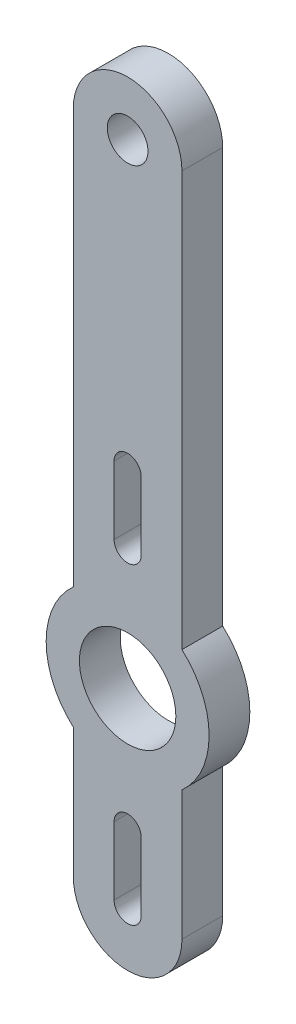
ISO-10303-21;
HEADER;
FILE_DESCRIPTION(('STEP AP214'),'2;1');
FILE_NAME('part.step','',(''),(''),'','','');
FILE_SCHEMA(('AUTOMOTIVE_DESIGN { 1 0 10303 214 1 1 1 1 }'));
ENDSEC;
DATA;
#1=APPLICATION_CONTEXT('core data for automotive mechanical design processes');
#2=APPLICATION_PROTOCOL_DEFINITION('international standard','automotive_design',2000,#1);
#3=PRODUCT_CONTEXT('',#1,'mechanical');
#4=PRODUCT('Part','Part','',(#3));
#5=PRODUCT_RELATED_PRODUCT_CATEGORY('part','',(#4));
#6=PRODUCT_DEFINITION_FORMATION('','',#4);
#7=PRODUCT_DEFINITION_CONTEXT('part definition',#1,'design');
#8=PRODUCT_DEFINITION('design','',#6,#7);
#9=PRODUCT_DEFINITION_SHAPE('','',#8);
#10=(LENGTH_UNIT() NAMED_UNIT(*) SI_UNIT(.MILLI.,.METRE.));
#11=(NAMED_UNIT(*) PLANE_ANGLE_UNIT() SI_UNIT($,.RADIAN.));
#12=(NAMED_UNIT(*) SI_UNIT($,.STERADIAN.) SOLID_ANGLE_UNIT());
#13=UNCERTAINTY_MEASURE_WITH_UNIT(LENGTH_MEASURE(1.E-05),#10,'distance_accuracy_value','');
#14=(GEOMETRIC_REPRESENTATION_CONTEXT(3) GLOBAL_UNCERTAINTY_ASSIGNED_CONTEXT((#13)) GLOBAL_UNIT_ASSIGNED_CONTEXT((#10,
#11,#12)) REPRESENTATION_CONTEXT('',''));
#15=CARTESIAN_POINT('',(0.,0.,0.));
#16=DIRECTION('',(0.,0.,1.));
#17=DIRECTION('',(1.,0.,0.));
#18=AXIS2_PLACEMENT_3D('',#15,#16,#17);
#19=CARTESIAN_POINT('',(0.,0.,3.));
#20=DIRECTION('',(0.,0.,1.));
#21=DIRECTION('',(1.,0.,0.));
#22=AXIS2_PLACEMENT_3D('',#19,#20,#21);
#23=PLANE('',#22);
#24=CARTESIAN_POINT('',(0.,14.,3.));
#25=DIRECTION('',(0.,0.,1.));
#26=DIRECTION('',(1.,0.,0.));
#27=AXIS2_PLACEMENT_3D('',#24,#25,#26);
#28=CIRCLE('',#27,3.55);
#29=CARTESIAN_POINT('',(3.55,14.,3.));
#30=VERTEX_POINT('',#29);
#31=EDGE_CURVE('E189',#30,#30,#28,.T.);
#32=ORIENTED_EDGE('',*,*,#31,.F.);
#33=EDGE_LOOP('',(#32));
#34=FACE_BOUND('',#33,.T.);
#35=CARTESIAN_POINT('',(0.,0.,3.));
#36=DIRECTION('',(0.,0.,1.));
#37=DIRECTION('',(1.,0.,0.));
#38=AXIS2_PLACEMENT_3D('',#35,#36,#37);
#39=CIRCLE('',#38,4.);
#40=CARTESIAN_POINT('',(-4.,0.,3.));
#41=VERTEX_POINT('',#40);
#42=CARTESIAN_POINT('',(4.,0.,3.));
#43=VERTEX_POINT('',#42);
#44=EDGE_CURVE('E226',#41,#43,#39,.T.);
#45=ORIENTED_EDGE('',*,*,#44,.T.);
#46=DIRECTION('',(0.,1.,0.));
#47=VECTOR('',#46,1.);
#48=CARTESIAN_POINT('',(4.,0.,3.));
#49=LINE('',#48,#47);
#50=CARTESIAN_POINT('',(4.,9.52786404500043,3.));
#51=VERTEX_POINT('',#50);
#52=EDGE_CURVE('E229',#43,#51,#49,.T.);
#53=ORIENTED_EDGE('',*,*,#52,.T.);
#54=CARTESIAN_POINT('',(0.,14.,3.));
#55=DIRECTION('',(0.,0.,1.));
#56=DIRECTION('',(1.,0.,0.));
#57=AXIS2_PLACEMENT_3D('',#54,#55,#56);
#58=CIRCLE('',#57,6.);
#59=CARTESIAN_POINT('',(4.,18.4721359549996,3.));
#60=VERTEX_POINT('',#59);
#61=EDGE_CURVE('E232',#51,#60,#58,.T.);
#62=ORIENTED_EDGE('',*,*,#61,.T.);
#63=DIRECTION('',(0.,1.,0.));
#64=VECTOR('',#63,1.);
#65=CARTESIAN_POINT('',(4.,18.4721359549996,3.));
#66=LINE('',#65,#64);
#67=CARTESIAN_POINT('',(4.,49.,3.));
#68=VERTEX_POINT('',#67);
#69=EDGE_CURVE('E234',#60,#68,#66,.T.);
#70=ORIENTED_EDGE('',*,*,#69,.T.);
#71=CARTESIAN_POINT('',(0.,49.,3.));
#72=DIRECTION('',(0.,0.,1.));
#73=DIRECTION('',(1.,0.,0.));
#74=AXIS2_PLACEMENT_3D('',#71,#72,#73);
#75=CIRCLE('',#74,4.);
#76=CARTESIAN_POINT('',(-4.,49.,3.));
#77=VERTEX_POINT('',#76);
#78=EDGE_CURVE('E236',#68,#77,#75,.T.);
#79=ORIENTED_EDGE('',*,*,#78,.T.);
#80=DIRECTION('',(0.,-1.,0.));
#81=VECTOR('',#80,1.);
#82=CARTESIAN_POINT('',(-4.,18.4721359549996,3.));
#83=LINE('',#82,#81);
#84=CARTESIAN_POINT('',(-4.,18.4721359549996,3.));
#85=VERTEX_POINT('',#84);
#86=EDGE_CURVE('E238',#77,#85,#83,.T.);
#87=ORIENTED_EDGE('',*,*,#86,.T.);
#88=CARTESIAN_POINT('',(0.,14.,3.));
#89=DIRECTION('',(0.,0.,1.));
#90=DIRECTION('',(1.,0.,0.));
#91=AXIS2_PLACEMENT_3D('',#88,#89,#90);
#92=CIRCLE('',#91,6.);
#93=CARTESIAN_POINT('',(-4.,9.52786404500043,3.));
#94=VERTEX_POINT('',#93);
#95=EDGE_CURVE('E240',#85,#94,#92,.T.);
#96=ORIENTED_EDGE('',*,*,#95,.T.);
#97=DIRECTION('',(0.,-1.,0.));
#98=VECTOR('',#97,1.);
#99=CARTESIAN_POINT('',(-4.,0.,3.));
#100=LINE('',#99,#98);
#101=EDGE_CURVE('E242',#94,#41,#100,.T.);
#102=ORIENTED_EDGE('',*,*,#101,.T.);
#103=EDGE_LOOP('',(#45,#53,#62,#70,#79,#87,#96,#102));
#104=FACE_BOUND('',#103,.T.);
#105=DIRECTION('',(0.,1.,0.));
#106=VECTOR('',#105,1.);
#107=CARTESIAN_POINT('',(1.,0.,3.));
#108=LINE('',#107,#106);
#109=CARTESIAN_POINT('',(1.,0.,3.));
#110=VERTEX_POINT('',#109);
#111=CARTESIAN_POINT('',(1.,5.,3.));
#112=VERTEX_POINT('',#111);
#113=EDGE_CURVE('E197',#110,#112,#108,.T.);
#114=ORIENTED_EDGE('',*,*,#113,.F.);
#115=CARTESIAN_POINT('',(0.,0.,3.));
#116=DIRECTION('',(0.,0.,1.));
#117=DIRECTION('',(1.,0.,0.));
#118=AXIS2_PLACEMENT_3D('',#115,#116,#117);
#119=CIRCLE('',#118,1.);
#120=CARTESIAN_POINT('',(-1.,0.,3.));
#121=VERTEX_POINT('',#120);
#122=EDGE_CURVE('E195',#121,#110,#119,.T.);
#123=ORIENTED_EDGE('',*,*,#122,.F.);
#124=DIRECTION('',(0.,-1.,0.));
#125=VECTOR('',#124,1.);
#126=CARTESIAN_POINT('',(-1.,0.,3.));
#127=LINE('',#126,#125);
#128=CARTESIAN_POINT('',(-1.,5.,3.));
#129=VERTEX_POINT('',#128);
#130=EDGE_CURVE('E203',#129,#121,#127,.T.);
#131=ORIENTED_EDGE('',*,*,#130,.F.);
#132=CARTESIAN_POINT('',(0.,5.,3.));
#133=DIRECTION('',(0.,0.,1.));
#134=DIRECTION('',(1.,0.,0.));
#135=AXIS2_PLACEMENT_3D('',#132,#133,#134);
#136=CIRCLE('',#135,1.);
#137=EDGE_CURVE('E200',#112,#129,#136,.T.);
#138=ORIENTED_EDGE('',*,*,#137,.F.);
#139=EDGE_LOOP('',(#114,#123,#131,#138));
#140=FACE_BOUND('',#139,.T.);
#141=CARTESIAN_POINT('',(0.,49.,3.));
#142=DIRECTION('',(0.,0.,1.));
#143=DIRECTION('',(1.,0.,0.));
#144=AXIS2_PLACEMENT_3D('',#141,#142,#143);
#145=CIRCLE('',#144,1.5);
#146=CARTESIAN_POINT('',(1.5,49.,3.));
#147=VERTEX_POINT('',#146);
#148=EDGE_CURVE('E183',#147,#147,#145,.T.);
#149=ORIENTED_EDGE('',*,*,#148,.F.);
#150=EDGE_LOOP('',(#149));
#151=FACE_BOUND('',#150,.T.);
#152=DIRECTION('',(0.,-1.,0.));
#153=VECTOR('',#152,1.);
#154=CARTESIAN_POINT('',(-1.00000000000001,28.,3.));
#155=LINE('',#154,#153);
#156=CARTESIAN_POINT('',(-1.00000000000001,28.,3.));
#157=VERTEX_POINT('',#156);
#158=CARTESIAN_POINT('',(-1.00000000000001,23.,3.));
#159=VERTEX_POINT('',#158);
#160=EDGE_CURVE('E155',#157,#159,#155,.T.);
#161=ORIENTED_EDGE('',*,*,#160,.F.);
#162=CARTESIAN_POINT('',(0.,28.,3.));
#163=DIRECTION('',(0.,0.,1.));
#164=DIRECTION('',(-1.,0.,0.));
#165=AXIS2_PLACEMENT_3D('',#162,#163,#164);
#166=CIRCLE('',#165,1.);
#167=CARTESIAN_POINT('',(0.999999999999993,28.,3.));
#168=VERTEX_POINT('',#167);
#169=EDGE_CURVE('E147',#168,#157,#166,.T.);
#170=ORIENTED_EDGE('',*,*,#169,.F.);
#171=DIRECTION('',(0.,1.,0.));
#172=VECTOR('',#171,1.);
#173=CARTESIAN_POINT('',(0.999999999999993,28.,3.));
#174=LINE('',#173,#172);
#175=CARTESIAN_POINT('',(0.999999999999993,23.,3.));
#176=VERTEX_POINT('',#175);
#177=EDGE_CURVE('E169',#176,#168,#174,.T.);
#178=ORIENTED_EDGE('',*,*,#177,.F.);
#179=CARTESIAN_POINT('',(0.,23.,3.));
#180=DIRECTION('',(0.,0.,1.));
#181=DIRECTION('',(-1.,0.,0.));
#182=AXIS2_PLACEMENT_3D('',#179,#180,#181);
#183=CIRCLE('',#182,1.);
#184=EDGE_CURVE('E167',#159,#176,#183,.T.);
#185=ORIENTED_EDGE('',*,*,#184,.F.);
#186=EDGE_LOOP('',(#161,#170,#178,#185));
#187=FACE_BOUND('',#186,.T.);
#188=ADVANCED_FACE('F34',(#34,#104,#140,#151,#187),#23,.T.);
#189=CARTESIAN_POINT('',(0.,0.,0.));
#190=DIRECTION('',(0.,0.,1.));
#191=DIRECTION('',(1.,0.,0.));
#192=AXIS2_PLACEMENT_3D('',#189,#190,#191);
#193=PLANE('',#192);
#194=CARTESIAN_POINT('',(0.,49.,0.));
#195=DIRECTION('',(0.,0.,1.));
#196=DIRECTION('',(1.,0.,0.));
#197=AXIS2_PLACEMENT_3D('',#194,#195,#196);
#198=CIRCLE('',#197,1.5);
#199=CARTESIAN_POINT('',(1.5,49.,0.));
#200=VERTEX_POINT('',#199);
#201=EDGE_CURVE('E163',#200,#200,#198,.T.);
#202=ORIENTED_EDGE('',*,*,#201,.T.);
#203=EDGE_LOOP('',(#202));
#204=FACE_BOUND('',#203,.T.);
#205=CARTESIAN_POINT('',(0.,14.,0.));
#206=DIRECTION('',(0.,0.,1.));
#207=DIRECTION('',(1.,0.,0.));
#208=AXIS2_PLACEMENT_3D('',#205,#206,#207);
#209=CIRCLE('',#208,3.55);
#210=CARTESIAN_POINT('',(3.55,14.,0.));
#211=VERTEX_POINT('',#210);
#212=EDGE_CURVE('E186',#211,#211,#209,.T.);
#213=ORIENTED_EDGE('',*,*,#212,.T.);
#214=EDGE_LOOP('',(#213));
#215=FACE_BOUND('',#214,.T.);
#216=CARTESIAN_POINT('',(0.,0.,0.));
#217=DIRECTION('',(0.,0.,1.));
#218=DIRECTION('',(1.,0.,0.));
#219=AXIS2_PLACEMENT_3D('',#216,#217,#218);
#220=CIRCLE('',#219,1.);
#221=CARTESIAN_POINT('',(-1.,0.,0.));
#222=VERTEX_POINT('',#221);
#223=CARTESIAN_POINT('',(1.,0.,0.));
#224=VERTEX_POINT('',#223);
#225=EDGE_CURVE('E192',#222,#224,#220,.T.);
#226=ORIENTED_EDGE('',*,*,#225,.T.);
#227=DIRECTION('',(0.,1.,0.));
#228=VECTOR('',#227,1.);
#229=CARTESIAN_POINT('',(1.,0.,0.));
#230=LINE('',#229,#228);
#231=CARTESIAN_POINT('',(1.,5.,0.));
#232=VERTEX_POINT('',#231);
#233=EDGE_CURVE('E208',#224,#232,#230,.T.);
#234=ORIENTED_EDGE('',*,*,#233,.T.);
#235=CARTESIAN_POINT('',(0.,5.,0.));
#236=DIRECTION('',(0.,0.,1.));
#237=DIRECTION('',(1.,0.,0.));
#238=AXIS2_PLACEMENT_3D('',#235,#236,#237);
#239=CIRCLE('',#238,1.);
#240=CARTESIAN_POINT('',(-1.,5.,0.));
#241=VERTEX_POINT('',#240);
#242=EDGE_CURVE('E211',#232,#241,#239,.T.);
#243=ORIENTED_EDGE('',*,*,#242,.T.);
#244=DIRECTION('',(0.,-1.,0.));
#245=VECTOR('',#244,1.);
#246=CARTESIAN_POINT('',(-1.,0.,0.));
#247=LINE('',#246,#245);
#248=EDGE_CURVE('E198',#241,#222,#247,.T.);
#249=ORIENTED_EDGE('',*,*,#248,.T.);
#250=EDGE_LOOP('',(#226,#234,#243,#249));
#251=FACE_BOUND('',#250,.T.);
#252=CARTESIAN_POINT('',(0.,0.,0.));
#253=DIRECTION('',(0.,0.,1.));
#254=DIRECTION('',(1.,0.,0.));
#255=AXIS2_PLACEMENT_3D('',#252,#253,#254);
#256=CIRCLE('',#255,4.);
#257=CARTESIAN_POINT('',(-4.,0.,0.));
#258=VERTEX_POINT('',#257);
#259=CARTESIAN_POINT('',(4.,0.,0.));
#260=VERTEX_POINT('',#259);
#261=EDGE_CURVE('E225',#258,#260,#256,.T.);
#262=ORIENTED_EDGE('',*,*,#261,.F.);
#263=DIRECTION('',(0.,-1.,0.));
#264=VECTOR('',#263,1.);
#265=CARTESIAN_POINT('',(-4.,0.,0.));
#266=LINE('',#265,#264);
#267=CARTESIAN_POINT('',(-4.,9.52786404500043,0.));
#268=VERTEX_POINT('',#267);
#269=EDGE_CURVE('E230',#268,#258,#266,.T.);
#270=ORIENTED_EDGE('',*,*,#269,.F.);
#271=CARTESIAN_POINT('',(0.,14.,0.));
#272=DIRECTION('',(0.,0.,1.));
#273=DIRECTION('',(1.,0.,0.));
#274=AXIS2_PLACEMENT_3D('',#271,#272,#273);
#275=CIRCLE('',#274,6.);
#276=CARTESIAN_POINT('',(-4.,18.4721359549996,0.));
#277=VERTEX_POINT('',#276);
#278=EDGE_CURVE('E257',#277,#268,#275,.T.);
#279=ORIENTED_EDGE('',*,*,#278,.F.);
#280=DIRECTION('',(0.,-1.,0.));
#281=VECTOR('',#280,1.);
#282=CARTESIAN_POINT('',(-4.,18.4721359549996,0.));
#283=LINE('',#282,#281);
#284=CARTESIAN_POINT('',(-4.,49.,0.));
#285=VERTEX_POINT('',#284);
#286=EDGE_CURVE('E255',#285,#277,#283,.T.);
#287=ORIENTED_EDGE('',*,*,#286,.F.);
#288=CARTESIAN_POINT('',(0.,49.,0.));
#289=DIRECTION('',(0.,0.,1.));
#290=DIRECTION('',(1.,0.,0.));
#291=AXIS2_PLACEMENT_3D('',#288,#289,#290);
#292=CIRCLE('',#291,4.);
#293=CARTESIAN_POINT('',(4.,49.,0.));
#294=VERTEX_POINT('',#293);
#295=EDGE_CURVE('E253',#294,#285,#292,.T.);
#296=ORIENTED_EDGE('',*,*,#295,.F.);
#297=DIRECTION('',(0.,1.,0.));
#298=VECTOR('',#297,1.);
#299=CARTESIAN_POINT('',(4.,18.4721359549996,0.));
#300=LINE('',#299,#298);
#301=CARTESIAN_POINT('',(4.,18.4721359549996,0.));
#302=VERTEX_POINT('',#301);
#303=EDGE_CURVE('E251',#302,#294,#300,.T.);
#304=ORIENTED_EDGE('',*,*,#303,.F.);
#305=CARTESIAN_POINT('',(0.,14.,0.));
#306=DIRECTION('',(0.,0.,1.));
#307=DIRECTION('',(1.,0.,0.));
#308=AXIS2_PLACEMENT_3D('',#305,#306,#307);
#309=CIRCLE('',#308,6.);
#310=CARTESIAN_POINT('',(4.,9.52786404500043,0.));
#311=VERTEX_POINT('',#310);
#312=EDGE_CURVE('E249',#311,#302,#309,.T.);
#313=ORIENTED_EDGE('',*,*,#312,.F.);
#314=DIRECTION('',(0.,1.,0.));
#315=VECTOR('',#314,1.);
#316=CARTESIAN_POINT('',(4.,0.,0.));
#317=LINE('',#316,#315);
#318=EDGE_CURVE('E247',#260,#311,#317,.T.);
#319=ORIENTED_EDGE('',*,*,#318,.F.);
#320=EDGE_LOOP('',(#262,#270,#279,#287,#296,#304,#313,#319));
#321=FACE_BOUND('',#320,.T.);
#322=CARTESIAN_POINT('',(0.,28.,0.));
#323=DIRECTION('',(0.,0.,1.));
#324=DIRECTION('',(-1.,0.,0.));
#325=AXIS2_PLACEMENT_3D('',#322,#323,#324);
#326=CIRCLE('',#325,1.);
#327=CARTESIAN_POINT('',(0.999999999999993,28.,0.));
#328=VERTEX_POINT('',#327);
#329=CARTESIAN_POINT('',(-1.00000000000001,28.,0.));
#330=VERTEX_POINT('',#329);
#331=EDGE_CURVE('E57',#328,#330,#326,.T.);
#332=ORIENTED_EDGE('',*,*,#331,.T.);
#333=DIRECTION('',(0.,-1.,0.));
#334=VECTOR('',#333,1.);
#335=CARTESIAN_POINT('',(-1.00000000000001,28.,0.));
#336=LINE('',#335,#334);
#337=CARTESIAN_POINT('',(-1.00000000000001,23.,0.));
#338=VERTEX_POINT('',#337);
#339=EDGE_CURVE('E162',#330,#338,#336,.T.);
#340=ORIENTED_EDGE('',*,*,#339,.T.);
#341=CARTESIAN_POINT('',(0.,23.,0.));
#342=DIRECTION('',(0.,0.,1.));
#343=DIRECTION('',(-1.,0.,0.));
#344=AXIS2_PLACEMENT_3D('',#341,#342,#343);
#345=CIRCLE('',#344,1.);
#346=CARTESIAN_POINT('',(0.999999999999993,23.,0.));
#347=VERTEX_POINT('',#346);
#348=EDGE_CURVE('E175',#338,#347,#345,.T.);
#349=ORIENTED_EDGE('',*,*,#348,.T.);
#350=DIRECTION('',(0.,1.,0.));
#351=VECTOR('',#350,1.);
#352=CARTESIAN_POINT('',(0.999999999999993,28.,0.));
#353=LINE('',#352,#351);
#354=EDGE_CURVE('E156',#347,#328,#353,.T.);
#355=ORIENTED_EDGE('',*,*,#354,.T.);
#356=EDGE_LOOP('',(#332,#340,#349,#355));
#357=FACE_BOUND('',#356,.T.);
#358=ADVANCED_FACE('F287',(#204,#215,#251,#321,#357),#193,.F.);
#359=CARTESIAN_POINT('',(0.,0.,3.));
#360=DIRECTION('',(0.,0.,-1.));
#361=DIRECTION('',(-1.,0.,0.));
#362=AXIS2_PLACEMENT_3D('',#359,#360,#361);
#363=CYLINDRICAL_SURFACE('',#362,4.);
#364=ORIENTED_EDGE('',*,*,#261,.T.);
#365=DIRECTION('',(0.,0.,-1.));
#366=VECTOR('',#365,1.);
#367=CARTESIAN_POINT('',(4.,0.,3.));
#368=LINE('',#367,#366);
#369=EDGE_CURVE('E11',#43,#260,#368,.T.);
#370=ORIENTED_EDGE('',*,*,#369,.F.);
#371=ORIENTED_EDGE('',*,*,#44,.F.);
#372=DIRECTION('',(0.,0.,-1.));
#373=VECTOR('',#372,1.);
#374=CARTESIAN_POINT('',(-4.,0.,3.));
#375=LINE('',#374,#373);
#376=EDGE_CURVE('E244',#41,#258,#375,.T.);
#377=ORIENTED_EDGE('',*,*,#376,.T.);
#378=EDGE_LOOP('',(#364,#370,#371,#377));
#379=FACE_BOUND('',#378,.T.);
#380=ADVANCED_FACE('F36',(#379),#363,.T.);
#381=CARTESIAN_POINT('',(4.,0.,3.));
#382=DIRECTION('',(-1.,0.,0.));
#383=DIRECTION('',(0.,0.,1.));
#384=AXIS2_PLACEMENT_3D('',#381,#382,#383);
#385=PLANE('',#384);
#386=ORIENTED_EDGE('',*,*,#318,.T.);
#387=DIRECTION('',(0.,0.,-1.));
#388=VECTOR('',#387,1.);
#389=CARTESIAN_POINT('',(4.,9.52786404500043,3.));
#390=LINE('',#389,#388);
#391=EDGE_CURVE('E42',#51,#311,#390,.T.);
#392=ORIENTED_EDGE('',*,*,#391,.F.);
#393=ORIENTED_EDGE('',*,*,#52,.F.);
#394=ORIENTED_EDGE('',*,*,#369,.T.);
#395=EDGE_LOOP('',(#386,#392,#393,#394));
#396=FACE_BOUND('',#395,.T.);
#397=ADVANCED_FACE('F305',(#396),#385,.F.);
#398=CARTESIAN_POINT('',(0.,14.,3.));
#399=DIRECTION('',(0.,0.,-1.));
#400=DIRECTION('',(-1.,0.,0.));
#401=AXIS2_PLACEMENT_3D('',#398,#399,#400);
#402=CYLINDRICAL_SURFACE('',#401,6.);
#403=ORIENTED_EDGE('',*,*,#312,.T.);
#404=DIRECTION('',(0.,0.,-1.));
#405=VECTOR('',#404,1.);
#406=CARTESIAN_POINT('',(4.,18.4721359549996,3.));
#407=LINE('',#406,#405);
#408=EDGE_CURVE('E274',#60,#302,#407,.T.);
#409=ORIENTED_EDGE('',*,*,#408,.F.);
#410=ORIENTED_EDGE('',*,*,#61,.F.);
#411=ORIENTED_EDGE('',*,*,#391,.T.);
#412=EDGE_LOOP('',(#403,#409,#410,#411));
#413=FACE_BOUND('',#412,.T.);
#414=ADVANCED_FACE('F281',(#413),#402,.T.);
#415=CARTESIAN_POINT('',(4.,18.4721359549996,3.));
#416=DIRECTION('',(-1.,0.,0.));
#417=DIRECTION('',(0.,0.,1.));
#418=AXIS2_PLACEMENT_3D('',#415,#416,#417);
#419=PLANE('',#418);
#420=ORIENTED_EDGE('',*,*,#303,.T.);
#421=DIRECTION('',(0.,0.,-1.));
#422=VECTOR('',#421,1.);
#423=CARTESIAN_POINT('',(4.,49.,3.));
#424=LINE('',#423,#422);
#425=EDGE_CURVE('E271',#68,#294,#424,.T.);
#426=ORIENTED_EDGE('',*,*,#425,.F.);
#427=ORIENTED_EDGE('',*,*,#69,.F.);
#428=ORIENTED_EDGE('',*,*,#408,.T.);
#429=EDGE_LOOP('',(#420,#426,#427,#428));
#430=FACE_BOUND('',#429,.T.);
#431=ADVANCED_FACE('F293',(#430),#419,.F.);
#432=CARTESIAN_POINT('',(0.,49.,3.));
#433=DIRECTION('',(0.,0.,-1.));
#434=DIRECTION('',(-1.,0.,0.));
#435=AXIS2_PLACEMENT_3D('',#432,#433,#434);
#436=CYLINDRICAL_SURFACE('',#435,4.);
#437=ORIENTED_EDGE('',*,*,#295,.T.);
#438=DIRECTION('',(0.,0.,-1.));
#439=VECTOR('',#438,1.);
#440=CARTESIAN_POINT('',(-4.,49.,3.));
#441=LINE('',#440,#439);
#442=EDGE_CURVE('E268',#77,#285,#441,.T.);
#443=ORIENTED_EDGE('',*,*,#442,.F.);
#444=ORIENTED_EDGE('',*,*,#78,.F.);
#445=ORIENTED_EDGE('',*,*,#425,.T.);
#446=EDGE_LOOP('',(#437,#443,#444,#445));
#447=FACE_BOUND('',#446,.T.);
#448=ADVANCED_FACE('F297',(#447),#436,.T.);
#449=CARTESIAN_POINT('',(-4.,18.4721359549996,3.));
#450=DIRECTION('',(1.,0.,0.));
#451=DIRECTION('',(0.,0.,-1.));
#452=AXIS2_PLACEMENT_3D('',#449,#450,#451);
#453=PLANE('',#452);
#454=ORIENTED_EDGE('',*,*,#286,.T.);
#455=DIRECTION('',(0.,0.,-1.));
#456=VECTOR('',#455,1.);
#457=CARTESIAN_POINT('',(-4.,18.4721359549996,3.));
#458=LINE('',#457,#456);
#459=EDGE_CURVE('E265',#85,#277,#458,.T.);
#460=ORIENTED_EDGE('',*,*,#459,.F.);
#461=ORIENTED_EDGE('',*,*,#86,.F.);
#462=ORIENTED_EDGE('',*,*,#442,.T.);
#463=EDGE_LOOP('',(#454,#460,#461,#462));
#464=FACE_BOUND('',#463,.T.);
#465=ADVANCED_FACE('F318',(#464),#453,.F.);
#466=CARTESIAN_POINT('',(0.,14.,3.));
#467=DIRECTION('',(0.,0.,-1.));
#468=DIRECTION('',(-1.,0.,0.));
#469=AXIS2_PLACEMENT_3D('',#466,#467,#468);
#470=CYLINDRICAL_SURFACE('',#469,6.);
#471=ORIENTED_EDGE('',*,*,#278,.T.);
#472=DIRECTION('',(0.,0.,-1.));
#473=VECTOR('',#472,1.);
#474=CARTESIAN_POINT('',(-4.,9.52786404500043,3.));
#475=LINE('',#474,#473);
#476=EDGE_CURVE('E262',#94,#268,#475,.T.);
#477=ORIENTED_EDGE('',*,*,#476,.F.);
#478=ORIENTED_EDGE('',*,*,#95,.F.);
#479=ORIENTED_EDGE('',*,*,#459,.T.);
#480=EDGE_LOOP('',(#471,#477,#478,#479));
#481=FACE_BOUND('',#480,.T.);
#482=ADVANCED_FACE('F316',(#481),#470,.T.);
#483=CARTESIAN_POINT('',(-4.,0.,3.));
#484=DIRECTION('',(1.,0.,0.));
#485=DIRECTION('',(0.,0.,-1.));
#486=AXIS2_PLACEMENT_3D('',#483,#484,#485);
#487=PLANE('',#486);
#488=ORIENTED_EDGE('',*,*,#269,.T.);
#489=ORIENTED_EDGE('',*,*,#376,.F.);
#490=ORIENTED_EDGE('',*,*,#101,.F.);
#491=ORIENTED_EDGE('',*,*,#476,.T.);
#492=EDGE_LOOP('',(#488,#489,#490,#491));
#493=FACE_BOUND('',#492,.T.);
#494=ADVANCED_FACE('F311',(#493),#487,.F.);
#495=CARTESIAN_POINT('',(0.,0.,3.));
#496=DIRECTION('',(0.,0.,-1.));
#497=DIRECTION('',(-1.,0.,0.));
#498=AXIS2_PLACEMENT_3D('',#495,#496,#497);
#499=CYLINDRICAL_SURFACE('',#498,1.);
#500=ORIENTED_EDGE('',*,*,#225,.F.);
#501=DIRECTION('',(0.,0.,-1.));
#502=VECTOR('',#501,1.);
#503=CARTESIAN_POINT('',(-1.,0.,3.));
#504=LINE('',#503,#502);
#505=EDGE_CURVE('E205',#121,#222,#504,.T.);
#506=ORIENTED_EDGE('',*,*,#505,.F.);
#507=ORIENTED_EDGE('',*,*,#122,.T.);
#508=DIRECTION('',(0.,0.,-1.));
#509=VECTOR('',#508,1.);
#510=CARTESIAN_POINT('',(1.,0.,3.));
#511=LINE('',#510,#509);
#512=EDGE_CURVE('E222',#110,#224,#511,.T.);
#513=ORIENTED_EDGE('',*,*,#512,.T.);
#514=EDGE_LOOP('',(#500,#506,#507,#513));
#515=FACE_BOUND('',#514,.T.);
#516=ADVANCED_FACE('F337',(#515),#499,.F.);
#517=CARTESIAN_POINT('',(1.,0.,3.));
#518=DIRECTION('',(-1.,0.,0.));
#519=DIRECTION('',(0.,0.,1.));
#520=AXIS2_PLACEMENT_3D('',#517,#518,#519);
#521=PLANE('',#520);
#522=ORIENTED_EDGE('',*,*,#233,.F.);
#523=ORIENTED_EDGE('',*,*,#512,.F.);
#524=ORIENTED_EDGE('',*,*,#113,.T.);
#525=DIRECTION('',(0.,0.,-1.));
#526=VECTOR('',#525,1.);
#527=CARTESIAN_POINT('',(1.,5.,3.));
#528=LINE('',#527,#526);
#529=EDGE_CURVE('E220',#112,#232,#528,.T.);
#530=ORIENTED_EDGE('',*,*,#529,.T.);
#531=EDGE_LOOP('',(#522,#523,#524,#530));
#532=FACE_BOUND('',#531,.T.);
#533=ADVANCED_FACE('F344',(#532),#521,.T.);
#534=CARTESIAN_POINT('',(0.,5.,3.));
#535=DIRECTION('',(0.,0.,-1.));
#536=DIRECTION('',(-1.,0.,0.));
#537=AXIS2_PLACEMENT_3D('',#534,#535,#536);
#538=CYLINDRICAL_SURFACE('',#537,1.);
#539=ORIENTED_EDGE('',*,*,#242,.F.);
#540=ORIENTED_EDGE('',*,*,#529,.F.);
#541=ORIENTED_EDGE('',*,*,#137,.T.);
#542=DIRECTION('',(0.,0.,-1.));
#543=VECTOR('',#542,1.);
#544=CARTESIAN_POINT('',(-1.,5.,3.));
#545=LINE('',#544,#543);
#546=EDGE_CURVE('E218',#129,#241,#545,.T.);
#547=ORIENTED_EDGE('',*,*,#546,.T.);
#548=EDGE_LOOP('',(#539,#540,#541,#547));
#549=FACE_BOUND('',#548,.T.);
#550=ADVANCED_FACE('F349',(#549),#538,.F.);
#551=CARTESIAN_POINT('',(-1.,0.,3.));
#552=DIRECTION('',(1.,0.,0.));
#553=DIRECTION('',(0.,0.,-1.));
#554=AXIS2_PLACEMENT_3D('',#551,#552,#553);
#555=PLANE('',#554);
#556=ORIENTED_EDGE('',*,*,#248,.F.);
#557=ORIENTED_EDGE('',*,*,#546,.F.);
#558=ORIENTED_EDGE('',*,*,#130,.T.);
#559=ORIENTED_EDGE('',*,*,#505,.T.);
#560=EDGE_LOOP('',(#556,#557,#558,#559));
#561=FACE_BOUND('',#560,.T.);
#562=ADVANCED_FACE('F357',(#561),#555,.T.);
#563=CARTESIAN_POINT('',(0.,14.,3.));
#564=DIRECTION('',(0.,0.,-1.));
#565=DIRECTION('',(-1.,0.,0.));
#566=AXIS2_PLACEMENT_3D('',#563,#564,#565);
#567=CYLINDRICAL_SURFACE('',#566,3.55);
#568=ORIENTED_EDGE('',*,*,#31,.T.);
#569=EDGE_LOOP('',(#568));
#570=FACE_BOUND('',#569,.T.);
#571=ORIENTED_EDGE('',*,*,#212,.F.);
#572=EDGE_LOOP('',(#571));
#573=FACE_BOUND('',#572,.T.);
#574=ADVANCED_FACE('F370',(#570,#573),#567,.F.);
#575=CARTESIAN_POINT('',(0.,49.,3.));
#576=DIRECTION('',(0.,0.,-1.));
#577=DIRECTION('',(-1.,0.,0.));
#578=AXIS2_PLACEMENT_3D('',#575,#576,#577);
#579=CYLINDRICAL_SURFACE('',#578,1.5);
#580=ORIENTED_EDGE('',*,*,#148,.T.);
#581=EDGE_LOOP('',(#580));
#582=FACE_BOUND('',#581,.T.);
#583=ORIENTED_EDGE('',*,*,#201,.F.);
#584=EDGE_LOOP('',(#583));
#585=FACE_BOUND('',#584,.T.);
#586=ADVANCED_FACE('F367',(#582,#585),#579,.F.);
#587=CARTESIAN_POINT('',(0.,28.,3.));
#588=DIRECTION('',(0.,0.,-1.));
#589=DIRECTION('',(-1.,0.,0.));
#590=AXIS2_PLACEMENT_3D('',#587,#588,#589);
#591=CYLINDRICAL_SURFACE('',#590,1.);
#592=ORIENTED_EDGE('',*,*,#331,.F.);
#593=DIRECTION('',(0.,0.,-1.));
#594=VECTOR('',#593,1.);
#595=CARTESIAN_POINT('',(0.999999999999993,28.,3.));
#596=LINE('',#595,#594);
#597=EDGE_CURVE('E151',#168,#328,#596,.T.);
#598=ORIENTED_EDGE('',*,*,#597,.F.);
#599=ORIENTED_EDGE('',*,*,#169,.T.);
#600=DIRECTION('',(0.,0.,-1.));
#601=VECTOR('',#600,1.);
#602=CARTESIAN_POINT('',(-1.00000000000001,28.,3.));
#603=LINE('',#602,#601);
#604=EDGE_CURVE('E150',#157,#330,#603,.T.);
#605=ORIENTED_EDGE('',*,*,#604,.T.);
#606=EDGE_LOOP('',(#592,#598,#599,#605));
#607=FACE_BOUND('',#606,.T.);
#608=ADVANCED_FACE('F149',(#607),#591,.F.);
#609=CARTESIAN_POINT('',(-1.00000000000001,28.,3.));
#610=DIRECTION('',(1.,0.,0.));
#611=DIRECTION('',(0.,0.,-1.));
#612=AXIS2_PLACEMENT_3D('',#609,#610,#611);
#613=PLANE('',#612);
#614=ORIENTED_EDGE('',*,*,#339,.F.);
#615=ORIENTED_EDGE('',*,*,#604,.F.);
#616=ORIENTED_EDGE('',*,*,#160,.T.);
#617=DIRECTION('',(0.,0.,-1.));
#618=VECTOR('',#617,1.);
#619=CARTESIAN_POINT('',(-1.00000000000001,23.,3.));
#620=LINE('',#619,#618);
#621=EDGE_CURVE('E164',#159,#338,#620,.T.);
#622=ORIENTED_EDGE('',*,*,#621,.T.);
#623=EDGE_LOOP('',(#614,#615,#616,#622));
#624=FACE_BOUND('',#623,.T.);
#625=ADVANCED_FACE('F159',(#624),#613,.T.);
#626=CARTESIAN_POINT('',(0.,23.,3.));
#627=DIRECTION('',(0.,0.,-1.));
#628=DIRECTION('',(-1.,0.,0.));
#629=AXIS2_PLACEMENT_3D('',#626,#627,#628);
#630=CYLINDRICAL_SURFACE('',#629,1.);
#631=ORIENTED_EDGE('',*,*,#348,.F.);
#632=ORIENTED_EDGE('',*,*,#621,.F.);
#633=ORIENTED_EDGE('',*,*,#184,.T.);
#634=DIRECTION('',(0.,0.,-1.));
#635=VECTOR('',#634,1.);
#636=CARTESIAN_POINT('',(0.999999999999993,23.,3.));
#637=LINE('',#636,#635);
#638=EDGE_CURVE('E49',#176,#347,#637,.T.);
#639=ORIENTED_EDGE('',*,*,#638,.T.);
#640=EDGE_LOOP('',(#631,#632,#633,#639));
#641=FACE_BOUND('',#640,.T.);
#642=ADVANCED_FACE('F420',(#641),#630,.F.);
#643=CARTESIAN_POINT('',(0.999999999999993,28.,3.));
#644=DIRECTION('',(-1.,0.,0.));
#645=DIRECTION('',(0.,0.,1.));
#646=AXIS2_PLACEMENT_3D('',#643,#644,#645);
#647=PLANE('',#646);
#648=ORIENTED_EDGE('',*,*,#354,.F.);
#649=ORIENTED_EDGE('',*,*,#638,.F.);
#650=ORIENTED_EDGE('',*,*,#177,.T.);
#651=ORIENTED_EDGE('',*,*,#597,.T.);
#652=EDGE_LOOP('',(#648,#649,#650,#651));
#653=FACE_BOUND('',#652,.T.);
#654=ADVANCED_FACE('F429',(#653),#647,.T.);
#655=CLOSED_SHELL('',(#188,#358,#380,#397,#414,#431,#448,#465,#482,#494,#516,#533,#550,#562,
#574,#586,#608,#625,#642,#654));
#656=MANIFOLD_SOLID_BREP('B2',#655);
#657=ADVANCED_BREP_SHAPE_REPRESENTATION('',(#18,#656),#14);
#658=SHAPE_DEFINITION_REPRESENTATION(#9,#657);
ENDSEC;
END-ISO-10303-21;
